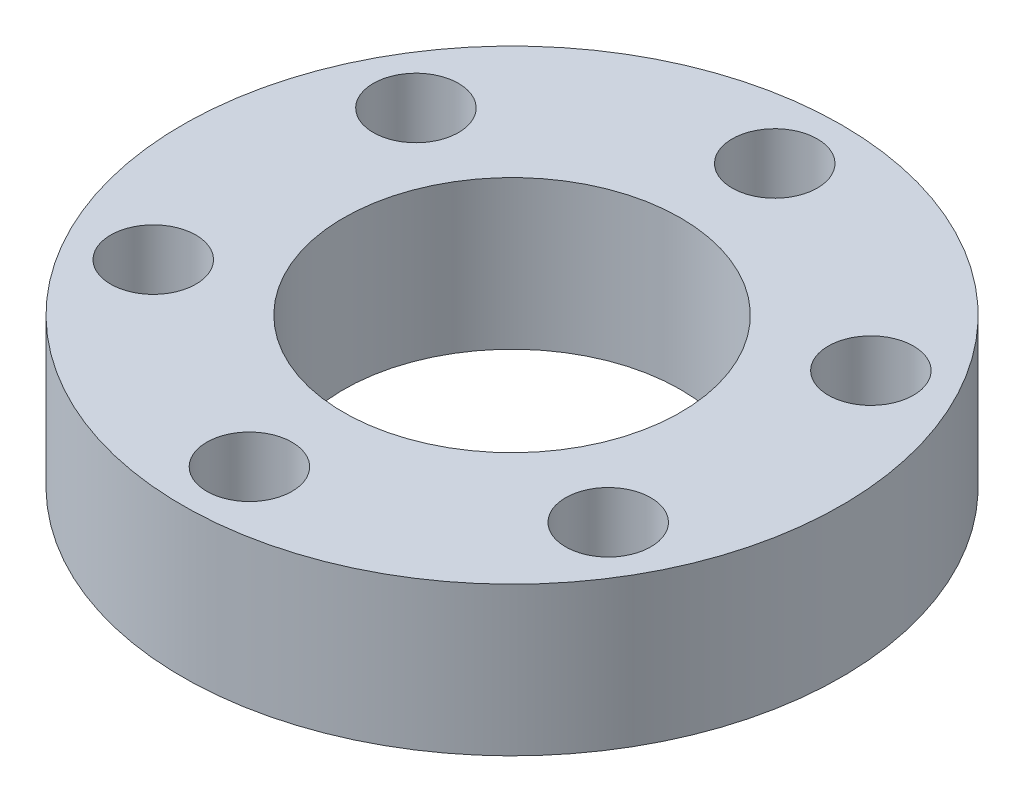
ISO-10303-21;
HEADER;
FILE_DESCRIPTION(('STEP AP214'),'2;1');
FILE_NAME('part.step','',(''),(''),'','','');
FILE_SCHEMA(('AUTOMOTIVE_DESIGN { 1 0 10303 214 1 1 1 1 }'));
ENDSEC;
DATA;
#1=APPLICATION_CONTEXT('core data for automotive mechanical design processes');
#2=APPLICATION_PROTOCOL_DEFINITION('international standard','automotive_design',2000,#1);
#3=PRODUCT_CONTEXT('',#1,'mechanical');
#4=PRODUCT('Part','Part','',(#3));
#5=PRODUCT_RELATED_PRODUCT_CATEGORY('part','',(#4));
#6=PRODUCT_DEFINITION_FORMATION('','',#4);
#7=PRODUCT_DEFINITION_CONTEXT('part definition',#1,'design');
#8=PRODUCT_DEFINITION('design','',#6,#7);
#9=PRODUCT_DEFINITION_SHAPE('','',#8);
#10=(LENGTH_UNIT() NAMED_UNIT(*) SI_UNIT(.MILLI.,.METRE.));
#11=(NAMED_UNIT(*) PLANE_ANGLE_UNIT() SI_UNIT($,.RADIAN.));
#12=(NAMED_UNIT(*) SI_UNIT($,.STERADIAN.) SOLID_ANGLE_UNIT());
#13=UNCERTAINTY_MEASURE_WITH_UNIT(LENGTH_MEASURE(1.E-05),#10,'distance_accuracy_value','');
#14=(GEOMETRIC_REPRESENTATION_CONTEXT(3) GLOBAL_UNCERTAINTY_ASSIGNED_CONTEXT((#13)) GLOBAL_UNIT_ASSIGNED_CONTEXT((#10,
#11,#12)) REPRESENTATION_CONTEXT('',''));
#15=CARTESIAN_POINT('',(0.,0.,0.));
#16=DIRECTION('',(0.,0.,1.));
#17=DIRECTION('',(1.,0.,0.));
#18=AXIS2_PLACEMENT_3D('',#15,#16,#17);
#19=CARTESIAN_POINT('',(0.,7.62,0.));
#20=DIRECTION('',(0.,1.,0.));
#21=DIRECTION('',(0.,0.,1.));
#22=AXIS2_PLACEMENT_3D('',#19,#20,#21);
#23=PLANE('',#22);
#24=CARTESIAN_POINT('',(11.6584339857462,7.62,6.73099999999989));
#25=DIRECTION('',(0.,1.,0.));
#26=DIRECTION('',(-0.866025403784443,0.,-0.499999999999992));
#27=AXIS2_PLACEMENT_3D('',#24,#25,#26);
#28=CIRCLE('',#27,2.1844);
#29=CARTESIAN_POINT('',(11.6584339857462,7.62,4.54659999999989));
#30=VERTEX_POINT('',#29);
#31=EDGE_CURVE('E68',#30,#30,#28,.T.);
#32=ORIENTED_EDGE('',*,*,#31,.F.);
#33=EDGE_LOOP('',(#32));
#34=FACE_BOUND('',#33,.T.);
#35=CARTESIAN_POINT('',(-11.6584339857461,7.62,6.73100000000006));
#36=DIRECTION('',(0.,1.,0.));
#37=DIRECTION('',(0.866025403784436,0.,-0.500000000000004));
#38=AXIS2_PLACEMENT_3D('',#35,#36,#37);
#39=CIRCLE('',#38,2.1844);
#40=CARTESIAN_POINT('',(-11.6584339857461,7.62,4.54660000000005));
#41=VERTEX_POINT('',#40);
#42=EDGE_CURVE('E56',#41,#41,#39,.T.);
#43=ORIENTED_EDGE('',*,*,#42,.F.);
#44=EDGE_LOOP('',(#43));
#45=FACE_BOUND('',#44,.T.);
#46=CARTESIAN_POINT('',(0.,7.62,-13.462));
#47=DIRECTION('',(0.,1.,0.));
#48=DIRECTION('',(0.,0.,1.));
#49=AXIS2_PLACEMENT_3D('',#46,#47,#48);
#50=CIRCLE('',#49,2.1844);
#51=CARTESIAN_POINT('',(0.,7.62,-15.6464));
#52=VERTEX_POINT('',#51);
#53=EDGE_CURVE('E44',#52,#52,#50,.T.);
#54=ORIENTED_EDGE('',*,*,#53,.F.);
#55=EDGE_LOOP('',(#54));
#56=FACE_BOUND('',#55,.T.);
#57=CARTESIAN_POINT('',(0.,7.62,0.));
#58=DIRECTION('',(0.,1.,0.));
#59=DIRECTION('',(0.,0.,1.));
#60=AXIS2_PLACEMENT_3D('',#57,#58,#59);
#61=CIRCLE('',#60,16.891);
#62=CARTESIAN_POINT('',(0.,7.62,-16.891));
#63=VERTEX_POINT('',#62);
#64=EDGE_CURVE('E10',#63,#63,#61,.T.);
#65=ORIENTED_EDGE('',*,*,#64,.T.);
#66=EDGE_LOOP('',(#65));
#67=FACE_BOUND('',#66,.T.);
#68=CARTESIAN_POINT('',(0.,7.62,0.));
#69=DIRECTION('',(0.,1.,0.));
#70=DIRECTION('',(0.,0.,1.));
#71=AXIS2_PLACEMENT_3D('',#68,#69,#70);
#72=CIRCLE('',#71,8.636);
#73=CARTESIAN_POINT('',(0.,7.62,-8.636));
#74=VERTEX_POINT('',#73);
#75=EDGE_CURVE('E39',#74,#74,#72,.T.);
#76=ORIENTED_EDGE('',*,*,#75,.F.);
#77=EDGE_LOOP('',(#76));
#78=FACE_BOUND('',#77,.T.);
#79=CARTESIAN_POINT('',(-11.6584339857461,7.62,-6.73099999999997));
#80=DIRECTION('',(0.,1.,0.));
#81=DIRECTION('',(0.86602540378444,0.,0.499999999999998));
#82=AXIS2_PLACEMENT_3D('',#79,#80,#81);
#83=CIRCLE('',#82,2.1844);
#84=CARTESIAN_POINT('',(-11.6584339857461,7.62,-8.91539999999997));
#85=VERTEX_POINT('',#84);
#86=EDGE_CURVE('E50',#85,#85,#83,.T.);
#87=ORIENTED_EDGE('',*,*,#86,.F.);
#88=EDGE_LOOP('',(#87));
#89=FACE_BOUND('',#88,.T.);
#90=CARTESIAN_POINT('',(0.,7.62,13.462));
#91=DIRECTION('',(0.,1.,0.));
#92=DIRECTION('',(0.,0.,-1.));
#93=AXIS2_PLACEMENT_3D('',#90,#91,#92);
#94=CIRCLE('',#93,2.1844);
#95=CARTESIAN_POINT('',(0.,7.62,11.2776));
#96=VERTEX_POINT('',#95);
#97=EDGE_CURVE('E62',#96,#96,#94,.T.);
#98=ORIENTED_EDGE('',*,*,#97,.F.);
#99=EDGE_LOOP('',(#98));
#100=FACE_BOUND('',#99,.T.);
#101=CARTESIAN_POINT('',(11.658433985746,7.62,-6.73100000000014));
#102=DIRECTION('',(0.,1.,0.));
#103=DIRECTION('',(-0.866025403784433,0.,0.50000000000001));
#104=AXIS2_PLACEMENT_3D('',#101,#102,#103);
#105=CIRCLE('',#104,2.1844);
#106=CARTESIAN_POINT('',(11.658433985746,7.62,-8.91540000000013));
#107=VERTEX_POINT('',#106);
#108=EDGE_CURVE('E74',#107,#107,#105,.T.);
#109=ORIENTED_EDGE('',*,*,#108,.F.);
#110=EDGE_LOOP('',(#109));
#111=FACE_BOUND('',#110,.T.);
#112=ADVANCED_FACE('F28',(#34,#45,#56,#67,#78,#89,#100,#111),#23,.T.);
#113=CARTESIAN_POINT('',(0.,0.,0.));
#114=DIRECTION('',(0.,1.,0.));
#115=DIRECTION('',(0.,0.,1.));
#116=AXIS2_PLACEMENT_3D('',#113,#114,#115);
#117=PLANE('',#116);
#118=CARTESIAN_POINT('',(11.6584339857462,0.,6.73099999999989));
#119=DIRECTION('',(0.,1.,0.));
#120=DIRECTION('',(-0.866025403784443,0.,-0.499999999999992));
#121=AXIS2_PLACEMENT_3D('',#118,#119,#120);
#122=CIRCLE('',#121,2.1844);
#123=CARTESIAN_POINT('',(11.6584339857462,0.,4.54659999999989));
#124=VERTEX_POINT('',#123);
#125=EDGE_CURVE('E71',#124,#124,#122,.T.);
#126=ORIENTED_EDGE('',*,*,#125,.T.);
#127=EDGE_LOOP('',(#126));
#128=FACE_BOUND('',#127,.T.);
#129=CARTESIAN_POINT('',(-11.6584339857461,0.,6.73100000000006));
#130=DIRECTION('',(0.,1.,0.));
#131=DIRECTION('',(0.866025403784436,0.,-0.500000000000004));
#132=AXIS2_PLACEMENT_3D('',#129,#130,#131);
#133=CIRCLE('',#132,2.1844);
#134=CARTESIAN_POINT('',(-11.6584339857461,0.,4.54660000000005));
#135=VERTEX_POINT('',#134);
#136=EDGE_CURVE('E59',#135,#135,#133,.T.);
#137=ORIENTED_EDGE('',*,*,#136,.T.);
#138=EDGE_LOOP('',(#137));
#139=FACE_BOUND('',#138,.T.);
#140=CARTESIAN_POINT('',(0.,0.,-13.462));
#141=DIRECTION('',(0.,1.,0.));
#142=DIRECTION('',(0.,0.,1.));
#143=AXIS2_PLACEMENT_3D('',#140,#141,#142);
#144=CIRCLE('',#143,2.1844);
#145=CARTESIAN_POINT('',(0.,0.,-15.6464));
#146=VERTEX_POINT('',#145);
#147=EDGE_CURVE('E47',#146,#146,#144,.T.);
#148=ORIENTED_EDGE('',*,*,#147,.T.);
#149=EDGE_LOOP('',(#148));
#150=FACE_BOUND('',#149,.T.);
#151=CARTESIAN_POINT('',(0.,0.,0.));
#152=DIRECTION('',(0.,1.,0.));
#153=DIRECTION('',(0.,0.,1.));
#154=AXIS2_PLACEMENT_3D('',#151,#152,#153);
#155=CIRCLE('',#154,16.891);
#156=CARTESIAN_POINT('',(0.,0.,-16.891));
#157=VERTEX_POINT('',#156);
#158=EDGE_CURVE('E32',#157,#157,#155,.T.);
#159=ORIENTED_EDGE('',*,*,#158,.F.);
#160=EDGE_LOOP('',(#159));
#161=FACE_BOUND('',#160,.T.);
#162=CARTESIAN_POINT('',(0.,0.,0.));
#163=DIRECTION('',(0.,1.,0.));
#164=DIRECTION('',(0.,0.,1.));
#165=AXIS2_PLACEMENT_3D('',#162,#163,#164);
#166=CIRCLE('',#165,8.636);
#167=CARTESIAN_POINT('',(0.,0.,-8.636));
#168=VERTEX_POINT('',#167);
#169=EDGE_CURVE('E41',#168,#168,#166,.T.);
#170=ORIENTED_EDGE('',*,*,#169,.T.);
#171=EDGE_LOOP('',(#170));
#172=FACE_BOUND('',#171,.T.);
#173=CARTESIAN_POINT('',(-11.6584339857461,0.,-6.73099999999997));
#174=DIRECTION('',(0.,1.,0.));
#175=DIRECTION('',(0.86602540378444,0.,0.499999999999998));
#176=AXIS2_PLACEMENT_3D('',#173,#174,#175);
#177=CIRCLE('',#176,2.1844);
#178=CARTESIAN_POINT('',(-11.6584339857461,0.,-8.91539999999997));
#179=VERTEX_POINT('',#178);
#180=EDGE_CURVE('E53',#179,#179,#177,.T.);
#181=ORIENTED_EDGE('',*,*,#180,.T.);
#182=EDGE_LOOP('',(#181));
#183=FACE_BOUND('',#182,.T.);
#184=CARTESIAN_POINT('',(0.,0.,13.462));
#185=DIRECTION('',(0.,1.,0.));
#186=DIRECTION('',(0.,0.,-1.));
#187=AXIS2_PLACEMENT_3D('',#184,#185,#186);
#188=CIRCLE('',#187,2.1844);
#189=CARTESIAN_POINT('',(0.,0.,11.2776));
#190=VERTEX_POINT('',#189);
#191=EDGE_CURVE('E65',#190,#190,#188,.T.);
#192=ORIENTED_EDGE('',*,*,#191,.T.);
#193=EDGE_LOOP('',(#192));
#194=FACE_BOUND('',#193,.T.);
#195=CARTESIAN_POINT('',(11.658433985746,0.,-6.73100000000014));
#196=DIRECTION('',(0.,1.,0.));
#197=DIRECTION('',(-0.866025403784433,0.,0.50000000000001));
#198=AXIS2_PLACEMENT_3D('',#195,#196,#197);
#199=CIRCLE('',#198,2.1844);
#200=CARTESIAN_POINT('',(11.658433985746,0.,-8.91540000000013));
#201=VERTEX_POINT('',#200);
#202=EDGE_CURVE('E77',#201,#201,#199,.T.);
#203=ORIENTED_EDGE('',*,*,#202,.T.);
#204=EDGE_LOOP('',(#203));
#205=FACE_BOUND('',#204,.T.);
#206=ADVANCED_FACE('F87',(#128,#139,#150,#161,#172,#183,#194,#205),#117,.F.);
#207=CARTESIAN_POINT('',(0.,7.62,0.));
#208=DIRECTION('',(0.,-1.,0.));
#209=DIRECTION('',(0.,0.,-1.));
#210=AXIS2_PLACEMENT_3D('',#207,#208,#209);
#211=CYLINDRICAL_SURFACE('',#210,16.891);
#212=CARTESIAN_POINT('',(0.,7.62,-16.891));
#213=CARTESIAN_POINT('',(0.,7.540625,-16.891));
#214=CARTESIAN_POINT('',(0.,7.46125,-16.891));
#215=CARTESIAN_POINT('',(0.,7.3025,-16.891));
#216=CARTESIAN_POINT('',(0.,7.223125,-16.891));
#217=CARTESIAN_POINT('',(0.,7.064375,-16.891));
#218=CARTESIAN_POINT('',(0.,6.985,-16.891));
#219=CARTESIAN_POINT('',(0.,6.82625,-16.891));
#220=CARTESIAN_POINT('',(0.,6.746875,-16.891));
#221=CARTESIAN_POINT('',(0.,6.588125,-16.891));
#222=CARTESIAN_POINT('',(0.,6.50875,-16.891));
#223=CARTESIAN_POINT('',(0.,6.35,-16.891));
#224=CARTESIAN_POINT('',(0.,6.270625,-16.891));
#225=CARTESIAN_POINT('',(0.,6.111875,-16.891));
#226=CARTESIAN_POINT('',(0.,6.0325,-16.891));
#227=CARTESIAN_POINT('',(0.,5.87375,-16.891));
#228=CARTESIAN_POINT('',(0.,5.794375,-16.891));
#229=CARTESIAN_POINT('',(0.,5.635625,-16.891));
#230=CARTESIAN_POINT('',(0.,5.55625,-16.891));
#231=CARTESIAN_POINT('',(0.,5.3975,-16.891));
#232=CARTESIAN_POINT('',(0.,5.318125,-16.891));
#233=CARTESIAN_POINT('',(0.,5.159375,-16.891));
#234=CARTESIAN_POINT('',(0.,5.08,-16.891));
#235=CARTESIAN_POINT('',(0.,4.92125,-16.891));
#236=CARTESIAN_POINT('',(0.,4.841875,-16.891));
#237=CARTESIAN_POINT('',(0.,4.683125,-16.891));
#238=CARTESIAN_POINT('',(0.,4.60375,-16.891));
#239=CARTESIAN_POINT('',(0.,4.445,-16.891));
#240=CARTESIAN_POINT('',(0.,4.365625,-16.891));
#241=CARTESIAN_POINT('',(0.,4.206875,-16.891));
#242=CARTESIAN_POINT('',(0.,4.1275,-16.891));
#243=CARTESIAN_POINT('',(0.,3.96875,-16.891));
#244=CARTESIAN_POINT('',(0.,3.889375,-16.891));
#245=CARTESIAN_POINT('',(0.,3.730625,-16.891));
#246=CARTESIAN_POINT('',(0.,3.65125,-16.891));
#247=CARTESIAN_POINT('',(0.,3.4925,-16.891));
#248=CARTESIAN_POINT('',(0.,3.413125,-16.891));
#249=CARTESIAN_POINT('',(0.,3.254375,-16.891));
#250=CARTESIAN_POINT('',(0.,3.175,-16.891));
#251=CARTESIAN_POINT('',(0.,3.01625,-16.891));
#252=CARTESIAN_POINT('',(0.,2.936875,-16.891));
#253=CARTESIAN_POINT('',(0.,2.778125,-16.891));
#254=CARTESIAN_POINT('',(0.,2.69875,-16.891));
#255=CARTESIAN_POINT('',(0.,2.54,-16.891));
#256=CARTESIAN_POINT('',(0.,2.460625,-16.891));
#257=CARTESIAN_POINT('',(0.,2.301875,-16.891));
#258=CARTESIAN_POINT('',(0.,2.2225,-16.891));
#259=CARTESIAN_POINT('',(0.,2.06375,-16.891));
#260=CARTESIAN_POINT('',(0.,1.984375,-16.891));
#261=CARTESIAN_POINT('',(0.,1.825625,-16.891));
#262=CARTESIAN_POINT('',(0.,1.74625,-16.891));
#263=CARTESIAN_POINT('',(0.,1.5875,-16.891));
#264=CARTESIAN_POINT('',(0.,1.508125,-16.891));
#265=CARTESIAN_POINT('',(0.,1.349375,-16.891));
#266=CARTESIAN_POINT('',(0.,1.27,-16.891));
#267=CARTESIAN_POINT('',(0.,1.11125,-16.891));
#268=CARTESIAN_POINT('',(0.,1.031875,-16.891));
#269=CARTESIAN_POINT('',(0.,0.873125,-16.891));
#270=CARTESIAN_POINT('',(0.,0.79375,-16.891));
#271=CARTESIAN_POINT('',(0.,0.635,-16.891));
#272=CARTESIAN_POINT('',(0.,0.555625,-16.891));
#273=CARTESIAN_POINT('',(0.,0.396875,-16.891));
#274=CARTESIAN_POINT('',(0.,0.3175,-16.891));
#275=CARTESIAN_POINT('',(0.,0.15875,-16.891));
#276=CARTESIAN_POINT('',(0.,0.0793749999999999,-16.891));
#277=CARTESIAN_POINT('',(0.,0.,-16.891));
#278=B_SPLINE_CURVE_WITH_KNOTS('',3,(#212,#213,#214,#215,#216,#217,#218,#219,#220,#221,#222,
#223,#224,#225,#226,#227,#228,#229,#230,#231,#232,#233,#234,#235,#236,#237,#238,#239,#240,#241,
#242,#243,#244,#245,#246,#247,#248,#249,#250,#251,#252,#253,#254,#255,#256,#257,#258,#259,#260,
#261,#262,#263,#264,#265,#266,#267,#268,#269,#270,#271,#272,#273,#274,#275,#276,#277),
.UNSPECIFIED.,.F.,.F.,(4,2,2,2,2,2,2,2,2,2,2,2,2,2,2,2,2,2,2,2,2,2,2,2,2,2,2,2,2,2,2,2,4),(0.,
0.238125,0.476249999999999,0.714375,0.952499999999999,1.190625,1.42875,1.666875,1.905,2.143125,
2.38125,2.619375,2.8575,3.095625,3.33375,3.571875,3.81,4.048125,4.28625,4.524375,4.7625,
5.000625,5.23875,5.476875,5.715,5.953125,6.19125,6.429375,6.6675,6.905625,7.14375,7.381875,
7.62),.UNSPECIFIED.);
#279=EDGE_CURVE('BSEAM30',#63,#157,#278,.T.);
#280=ORIENTED_EDGE('',*,*,#64,.F.);
#281=ORIENTED_EDGE('',*,*,#158,.T.);
#282=ORIENTED_EDGE('',*,*,#279,.T.);
#283=ORIENTED_EDGE('',*,*,#279,.F.);
#284=EDGE_LOOP('',(#280,#282,#281,#283));
#285=FACE_BOUND('',#284,.T.);
#286=ADVANCED_FACE('F30',(#285),#211,.T.);
#287=CARTESIAN_POINT('',(0.,7.62,0.));
#288=DIRECTION('',(0.,-1.,0.));
#289=DIRECTION('',(0.,0.,-1.));
#290=AXIS2_PLACEMENT_3D('',#287,#288,#289);
#291=CYLINDRICAL_SURFACE('',#290,8.636);
#292=CARTESIAN_POINT('',(0.,7.62,-8.636));
#293=CARTESIAN_POINT('',(0.,7.540625,-8.636));
#294=CARTESIAN_POINT('',(0.,7.46125,-8.636));
#295=CARTESIAN_POINT('',(0.,7.3025,-8.636));
#296=CARTESIAN_POINT('',(0.,7.223125,-8.636));
#297=CARTESIAN_POINT('',(0.,7.064375,-8.636));
#298=CARTESIAN_POINT('',(0.,6.985,-8.636));
#299=CARTESIAN_POINT('',(0.,6.82625,-8.636));
#300=CARTESIAN_POINT('',(0.,6.746875,-8.636));
#301=CARTESIAN_POINT('',(0.,6.588125,-8.636));
#302=CARTESIAN_POINT('',(0.,6.50875,-8.636));
#303=CARTESIAN_POINT('',(0.,6.35,-8.636));
#304=CARTESIAN_POINT('',(0.,6.270625,-8.636));
#305=CARTESIAN_POINT('',(0.,6.111875,-8.636));
#306=CARTESIAN_POINT('',(0.,6.0325,-8.636));
#307=CARTESIAN_POINT('',(0.,5.87375,-8.636));
#308=CARTESIAN_POINT('',(0.,5.794375,-8.636));
#309=CARTESIAN_POINT('',(0.,5.635625,-8.636));
#310=CARTESIAN_POINT('',(0.,5.55625,-8.636));
#311=CARTESIAN_POINT('',(0.,5.3975,-8.636));
#312=CARTESIAN_POINT('',(0.,5.318125,-8.636));
#313=CARTESIAN_POINT('',(0.,5.159375,-8.636));
#314=CARTESIAN_POINT('',(0.,5.08,-8.636));
#315=CARTESIAN_POINT('',(0.,4.92125,-8.636));
#316=CARTESIAN_POINT('',(0.,4.841875,-8.636));
#317=CARTESIAN_POINT('',(0.,4.683125,-8.636));
#318=CARTESIAN_POINT('',(0.,4.60375,-8.636));
#319=CARTESIAN_POINT('',(0.,4.445,-8.636));
#320=CARTESIAN_POINT('',(0.,4.365625,-8.636));
#321=CARTESIAN_POINT('',(0.,4.206875,-8.636));
#322=CARTESIAN_POINT('',(0.,4.1275,-8.636));
#323=CARTESIAN_POINT('',(0.,3.96875,-8.636));
#324=CARTESIAN_POINT('',(0.,3.889375,-8.636));
#325=CARTESIAN_POINT('',(0.,3.730625,-8.636));
#326=CARTESIAN_POINT('',(0.,3.65125,-8.636));
#327=CARTESIAN_POINT('',(0.,3.4925,-8.636));
#328=CARTESIAN_POINT('',(0.,3.413125,-8.636));
#329=CARTESIAN_POINT('',(0.,3.254375,-8.636));
#330=CARTESIAN_POINT('',(0.,3.175,-8.636));
#331=CARTESIAN_POINT('',(0.,3.01625,-8.636));
#332=CARTESIAN_POINT('',(0.,2.936875,-8.636));
#333=CARTESIAN_POINT('',(0.,2.778125,-8.636));
#334=CARTESIAN_POINT('',(0.,2.69875,-8.636));
#335=CARTESIAN_POINT('',(0.,2.54,-8.636));
#336=CARTESIAN_POINT('',(0.,2.460625,-8.636));
#337=CARTESIAN_POINT('',(0.,2.301875,-8.636));
#338=CARTESIAN_POINT('',(0.,2.2225,-8.636));
#339=CARTESIAN_POINT('',(0.,2.06375,-8.636));
#340=CARTESIAN_POINT('',(0.,1.984375,-8.636));
#341=CARTESIAN_POINT('',(0.,1.825625,-8.636));
#342=CARTESIAN_POINT('',(0.,1.74625,-8.636));
#343=CARTESIAN_POINT('',(0.,1.5875,-8.636));
#344=CARTESIAN_POINT('',(0.,1.508125,-8.636));
#345=CARTESIAN_POINT('',(0.,1.349375,-8.636));
#346=CARTESIAN_POINT('',(0.,1.27,-8.636));
#347=CARTESIAN_POINT('',(0.,1.11125,-8.636));
#348=CARTESIAN_POINT('',(0.,1.031875,-8.636));
#349=CARTESIAN_POINT('',(0.,0.873125,-8.636));
#350=CARTESIAN_POINT('',(0.,0.79375,-8.636));
#351=CARTESIAN_POINT('',(0.,0.635,-8.636));
#352=CARTESIAN_POINT('',(0.,0.555625,-8.636));
#353=CARTESIAN_POINT('',(0.,0.396875,-8.636));
#354=CARTESIAN_POINT('',(0.,0.3175,-8.636));
#355=CARTESIAN_POINT('',(0.,0.15875,-8.636));
#356=CARTESIAN_POINT('',(0.,0.0793749999999999,-8.636));
#357=CARTESIAN_POINT('',(0.,0.,-8.636));
#358=B_SPLINE_CURVE_WITH_KNOTS('',3,(#292,#293,#294,#295,#296,#297,#298,#299,#300,#301,#302,
#303,#304,#305,#306,#307,#308,#309,#310,#311,#312,#313,#314,#315,#316,#317,#318,#319,#320,#321,
#322,#323,#324,#325,#326,#327,#328,#329,#330,#331,#332,#333,#334,#335,#336,#337,#338,#339,#340,
#341,#342,#343,#344,#345,#346,#347,#348,#349,#350,#351,#352,#353,#354,#355,#356,#357),
.UNSPECIFIED.,.F.,.F.,(4,2,2,2,2,2,2,2,2,2,2,2,2,2,2,2,2,2,2,2,2,2,2,2,2,2,2,2,2,2,2,2,4),(0.,
0.238125,0.47625,0.714375000000001,0.9525,1.190625,1.42875,1.666875,1.905,2.143125,2.38125,
2.619375,2.8575,3.095625,3.33375,3.571875,3.81,4.048125,4.28625,4.524375,4.7625,5.000625,
5.23875,5.476875,5.715,5.953125,6.19125,6.429375,6.6675,6.905625,7.14375,7.381875,7.62),.UNSPECIFIED.);
#359=EDGE_CURVE('BSEAM97',#74,#168,#358,.T.);
#360=ORIENTED_EDGE('',*,*,#75,.T.);
#361=ORIENTED_EDGE('',*,*,#169,.F.);
#362=ORIENTED_EDGE('',*,*,#359,.T.);
#363=ORIENTED_EDGE('',*,*,#359,.F.);
#364=EDGE_LOOP('',(#360,#362,#361,#363));
#365=FACE_BOUND('',#364,.T.);
#366=ADVANCED_FACE('F97',(#365),#291,.F.);
#367=CARTESIAN_POINT('',(0.,7.62,-13.462));
#368=DIRECTION('',(0.,-1.,0.));
#369=DIRECTION('',(0.,0.,-1.));
#370=AXIS2_PLACEMENT_3D('',#367,#368,#369);
#371=CYLINDRICAL_SURFACE('',#370,2.1844);
#372=CARTESIAN_POINT('',(0.,7.62,-15.6464));
#373=CARTESIAN_POINT('',(0.,7.540625,-15.6464));
#374=CARTESIAN_POINT('',(0.,7.46125,-15.6464));
#375=CARTESIAN_POINT('',(0.,7.3025,-15.6464));
#376=CARTESIAN_POINT('',(0.,7.223125,-15.6464));
#377=CARTESIAN_POINT('',(0.,7.064375,-15.6464));
#378=CARTESIAN_POINT('',(0.,6.985,-15.6464));
#379=CARTESIAN_POINT('',(0.,6.82625,-15.6464));
#380=CARTESIAN_POINT('',(0.,6.746875,-15.6464));
#381=CARTESIAN_POINT('',(0.,6.588125,-15.6464));
#382=CARTESIAN_POINT('',(0.,6.50875,-15.6464));
#383=CARTESIAN_POINT('',(0.,6.35,-15.6464));
#384=CARTESIAN_POINT('',(0.,6.270625,-15.6464));
#385=CARTESIAN_POINT('',(0.,6.111875,-15.6464));
#386=CARTESIAN_POINT('',(0.,6.0325,-15.6464));
#387=CARTESIAN_POINT('',(0.,5.87375,-15.6464));
#388=CARTESIAN_POINT('',(0.,5.794375,-15.6464));
#389=CARTESIAN_POINT('',(0.,5.635625,-15.6464));
#390=CARTESIAN_POINT('',(0.,5.55625,-15.6464));
#391=CARTESIAN_POINT('',(0.,5.3975,-15.6464));
#392=CARTESIAN_POINT('',(0.,5.318125,-15.6464));
#393=CARTESIAN_POINT('',(0.,5.159375,-15.6464));
#394=CARTESIAN_POINT('',(0.,5.08,-15.6464));
#395=CARTESIAN_POINT('',(0.,4.92125,-15.6464));
#396=CARTESIAN_POINT('',(0.,4.841875,-15.6464));
#397=CARTESIAN_POINT('',(0.,4.683125,-15.6464));
#398=CARTESIAN_POINT('',(0.,4.60375,-15.6464));
#399=CARTESIAN_POINT('',(0.,4.445,-15.6464));
#400=CARTESIAN_POINT('',(0.,4.365625,-15.6464));
#401=CARTESIAN_POINT('',(0.,4.206875,-15.6464));
#402=CARTESIAN_POINT('',(0.,4.1275,-15.6464));
#403=CARTESIAN_POINT('',(0.,3.96875,-15.6464));
#404=CARTESIAN_POINT('',(0.,3.889375,-15.6464));
#405=CARTESIAN_POINT('',(0.,3.730625,-15.6464));
#406=CARTESIAN_POINT('',(0.,3.65125,-15.6464));
#407=CARTESIAN_POINT('',(0.,3.4925,-15.6464));
#408=CARTESIAN_POINT('',(0.,3.413125,-15.6464));
#409=CARTESIAN_POINT('',(0.,3.254375,-15.6464));
#410=CARTESIAN_POINT('',(0.,3.175,-15.6464));
#411=CARTESIAN_POINT('',(0.,3.01625,-15.6464));
#412=CARTESIAN_POINT('',(0.,2.936875,-15.6464));
#413=CARTESIAN_POINT('',(0.,2.778125,-15.6464));
#414=CARTESIAN_POINT('',(0.,2.69875,-15.6464));
#415=CARTESIAN_POINT('',(0.,2.54,-15.6464));
#416=CARTESIAN_POINT('',(0.,2.460625,-15.6464));
#417=CARTESIAN_POINT('',(0.,2.301875,-15.6464));
#418=CARTESIAN_POINT('',(0.,2.2225,-15.6464));
#419=CARTESIAN_POINT('',(0.,2.06375,-15.6464));
#420=CARTESIAN_POINT('',(0.,1.984375,-15.6464));
#421=CARTESIAN_POINT('',(0.,1.825625,-15.6464));
#422=CARTESIAN_POINT('',(0.,1.74625,-15.6464));
#423=CARTESIAN_POINT('',(0.,1.5875,-15.6464));
#424=CARTESIAN_POINT('',(0.,1.508125,-15.6464));
#425=CARTESIAN_POINT('',(0.,1.349375,-15.6464));
#426=CARTESIAN_POINT('',(0.,1.27,-15.6464));
#427=CARTESIAN_POINT('',(0.,1.11125,-15.6464));
#428=CARTESIAN_POINT('',(0.,1.031875,-15.6464));
#429=CARTESIAN_POINT('',(0.,0.873125,-15.6464));
#430=CARTESIAN_POINT('',(0.,0.79375,-15.6464));
#431=CARTESIAN_POINT('',(0.,0.635,-15.6464));
#432=CARTESIAN_POINT('',(0.,0.555625,-15.6464));
#433=CARTESIAN_POINT('',(0.,0.396875,-15.6464));
#434=CARTESIAN_POINT('',(0.,0.3175,-15.6464));
#435=CARTESIAN_POINT('',(0.,0.15875,-15.6464));
#436=CARTESIAN_POINT('',(0.,0.0793749999999999,-15.6464));
#437=CARTESIAN_POINT('',(0.,0.,-15.6464));
#438=B_SPLINE_CURVE_WITH_KNOTS('',3,(#372,#373,#374,#375,#376,#377,#378,#379,#380,#381,#382,
#383,#384,#385,#386,#387,#388,#389,#390,#391,#392,#393,#394,#395,#396,#397,#398,#399,#400,#401,
#402,#403,#404,#405,#406,#407,#408,#409,#410,#411,#412,#413,#414,#415,#416,#417,#418,#419,#420,
#421,#422,#423,#424,#425,#426,#427,#428,#429,#430,#431,#432,#433,#434,#435,#436,#437),
.UNSPECIFIED.,.F.,.F.,(4,2,2,2,2,2,2,2,2,2,2,2,2,2,2,2,2,2,2,2,2,2,2,2,2,2,2,2,2,2,2,2,4),(0.,
0.238125,0.47625,0.714375000000001,0.9525,1.190625,1.42875,1.666875,1.905,2.143125,2.38125,
2.619375,2.8575,3.095625,3.33375,3.571875,3.81,4.048125,4.28625,4.524375,4.7625,5.000625,
5.23875,5.476875,5.715,5.953125,6.19125,6.429375,6.6675,6.905625,7.14375,7.381875,7.62),.UNSPECIFIED.);
#439=EDGE_CURVE('BSEAM100',#52,#146,#438,.T.);
#440=ORIENTED_EDGE('',*,*,#53,.T.);
#441=ORIENTED_EDGE('',*,*,#147,.F.);
#442=ORIENTED_EDGE('',*,*,#439,.T.);
#443=ORIENTED_EDGE('',*,*,#439,.F.);
#444=EDGE_LOOP('',(#440,#442,#441,#443));
#445=FACE_BOUND('',#444,.T.);
#446=ADVANCED_FACE('F100',(#445),#371,.F.);
#447=CARTESIAN_POINT('',(-11.6584339857461,7.62,-6.73099999999997));
#448=DIRECTION('',(0.,-1.,0.));
#449=DIRECTION('',(0.,0.,-1.));
#450=AXIS2_PLACEMENT_3D('',#447,#448,#449);
#451=CYLINDRICAL_SURFACE('',#450,2.1844);
#452=CARTESIAN_POINT('',(-11.6584339857461,7.62,-8.91539999999997));
#453=CARTESIAN_POINT('',(-11.6584339857461,7.540625,-8.91539999999997));
#454=CARTESIAN_POINT('',(-11.6584339857461,7.46125,-8.91539999999997));
#455=CARTESIAN_POINT('',(-11.6584339857461,7.3025,-8.91539999999997));
#456=CARTESIAN_POINT('',(-11.6584339857461,7.223125,-8.91539999999997));
#457=CARTESIAN_POINT('',(-11.6584339857461,7.064375,-8.91539999999997));
#458=CARTESIAN_POINT('',(-11.6584339857461,6.985,-8.91539999999997));
#459=CARTESIAN_POINT('',(-11.6584339857461,6.82625,-8.91539999999997));
#460=CARTESIAN_POINT('',(-11.6584339857461,6.746875,-8.91539999999997));
#461=CARTESIAN_POINT('',(-11.6584339857461,6.588125,-8.91539999999997));
#462=CARTESIAN_POINT('',(-11.6584339857461,6.50875,-8.91539999999997));
#463=CARTESIAN_POINT('',(-11.6584339857461,6.35,-8.91539999999997));
#464=CARTESIAN_POINT('',(-11.6584339857461,6.270625,-8.91539999999997));
#465=CARTESIAN_POINT('',(-11.6584339857461,6.111875,-8.91539999999997));
#466=CARTESIAN_POINT('',(-11.6584339857461,6.0325,-8.91539999999997));
#467=CARTESIAN_POINT('',(-11.6584339857461,5.87375,-8.91539999999997));
#468=CARTESIAN_POINT('',(-11.6584339857461,5.794375,-8.91539999999997));
#469=CARTESIAN_POINT('',(-11.6584339857461,5.635625,-8.91539999999997));
#470=CARTESIAN_POINT('',(-11.6584339857461,5.55625,-8.91539999999997));
#471=CARTESIAN_POINT('',(-11.6584339857461,5.3975,-8.91539999999997));
#472=CARTESIAN_POINT('',(-11.6584339857461,5.318125,-8.91539999999997));
#473=CARTESIAN_POINT('',(-11.6584339857461,5.159375,-8.91539999999997));
#474=CARTESIAN_POINT('',(-11.6584339857461,5.08,-8.91539999999997));
#475=CARTESIAN_POINT('',(-11.6584339857461,4.92125,-8.91539999999997));
#476=CARTESIAN_POINT('',(-11.6584339857461,4.841875,-8.91539999999997));
#477=CARTESIAN_POINT('',(-11.6584339857461,4.683125,-8.91539999999997));
#478=CARTESIAN_POINT('',(-11.6584339857461,4.60375,-8.91539999999997));
#479=CARTESIAN_POINT('',(-11.6584339857461,4.445,-8.91539999999997));
#480=CARTESIAN_POINT('',(-11.6584339857461,4.365625,-8.91539999999997));
#481=CARTESIAN_POINT('',(-11.6584339857461,4.206875,-8.91539999999997));
#482=CARTESIAN_POINT('',(-11.6584339857461,4.1275,-8.91539999999997));
#483=CARTESIAN_POINT('',(-11.6584339857461,3.96875,-8.91539999999997));
#484=CARTESIAN_POINT('',(-11.6584339857461,3.889375,-8.91539999999997));
#485=CARTESIAN_POINT('',(-11.6584339857461,3.730625,-8.91539999999997));
#486=CARTESIAN_POINT('',(-11.6584339857461,3.65125,-8.91539999999997));
#487=CARTESIAN_POINT('',(-11.6584339857461,3.4925,-8.91539999999997));
#488=CARTESIAN_POINT('',(-11.6584339857461,3.413125,-8.91539999999997));
#489=CARTESIAN_POINT('',(-11.6584339857461,3.254375,-8.91539999999997));
#490=CARTESIAN_POINT('',(-11.6584339857461,3.175,-8.91539999999997));
#491=CARTESIAN_POINT('',(-11.6584339857461,3.01625,-8.91539999999997));
#492=CARTESIAN_POINT('',(-11.6584339857461,2.936875,-8.91539999999997));
#493=CARTESIAN_POINT('',(-11.6584339857461,2.778125,-8.91539999999997));
#494=CARTESIAN_POINT('',(-11.6584339857461,2.69875,-8.91539999999997));
#495=CARTESIAN_POINT('',(-11.6584339857461,2.54,-8.91539999999997));
#496=CARTESIAN_POINT('',(-11.6584339857461,2.460625,-8.91539999999997));
#497=CARTESIAN_POINT('',(-11.6584339857461,2.301875,-8.91539999999997));
#498=CARTESIAN_POINT('',(-11.6584339857461,2.2225,-8.91539999999997));
#499=CARTESIAN_POINT('',(-11.6584339857461,2.06375,-8.91539999999997));
#500=CARTESIAN_POINT('',(-11.6584339857461,1.984375,-8.91539999999997));
#501=CARTESIAN_POINT('',(-11.6584339857461,1.825625,-8.91539999999997));
#502=CARTESIAN_POINT('',(-11.6584339857461,1.74625,-8.91539999999997));
#503=CARTESIAN_POINT('',(-11.6584339857461,1.5875,-8.91539999999997));
#504=CARTESIAN_POINT('',(-11.6584339857461,1.508125,-8.91539999999997));
#505=CARTESIAN_POINT('',(-11.6584339857461,1.349375,-8.91539999999997));
#506=CARTESIAN_POINT('',(-11.6584339857461,1.27,-8.91539999999997));
#507=CARTESIAN_POINT('',(-11.6584339857461,1.11125,-8.91539999999997));
#508=CARTESIAN_POINT('',(-11.6584339857461,1.031875,-8.91539999999997));
#509=CARTESIAN_POINT('',(-11.6584339857461,0.873125,-8.91539999999997));
#510=CARTESIAN_POINT('',(-11.6584339857461,0.79375,-8.91539999999997));
#511=CARTESIAN_POINT('',(-11.6584339857461,0.635,-8.91539999999997));
#512=CARTESIAN_POINT('',(-11.6584339857461,0.555625,-8.91539999999997));
#513=CARTESIAN_POINT('',(-11.6584339857461,0.396875,-8.91539999999997));
#514=CARTESIAN_POINT('',(-11.6584339857461,0.3175,-8.91539999999997));
#515=CARTESIAN_POINT('',(-11.6584339857461,0.15875,-8.91539999999997));
#516=CARTESIAN_POINT('',(-11.6584339857461,0.0793749999999999,-8.91539999999997));
#517=CARTESIAN_POINT('',(-11.6584339857461,0.,-8.91539999999997));
#518=B_SPLINE_CURVE_WITH_KNOTS('',3,(#452,#453,#454,#455,#456,#457,#458,#459,#460,#461,#462,
#463,#464,#465,#466,#467,#468,#469,#470,#471,#472,#473,#474,#475,#476,#477,#478,#479,#480,#481,
#482,#483,#484,#485,#486,#487,#488,#489,#490,#491,#492,#493,#494,#495,#496,#497,#498,#499,#500,
#501,#502,#503,#504,#505,#506,#507,#508,#509,#510,#511,#512,#513,#514,#515,#516,#517),
.UNSPECIFIED.,.F.,.F.,(4,2,2,2,2,2,2,2,2,2,2,2,2,2,2,2,2,2,2,2,2,2,2,2,2,2,2,2,2,2,2,2,4),(0.,
0.238125,0.47625,0.714375000000001,0.9525,1.190625,1.42875,1.666875,1.905,2.143125,2.38125,
2.619375,2.8575,3.095625,3.33375,3.571875,3.81,4.048125,4.28625,4.524375,4.7625,5.000625,
5.23875,5.476875,5.715,5.953125,6.19125,6.429375,6.6675,6.905625,7.14375,7.381875,7.62),.UNSPECIFIED.);
#519=EDGE_CURVE('BSEAM104',#85,#179,#518,.T.);
#520=ORIENTED_EDGE('',*,*,#86,.T.);
#521=ORIENTED_EDGE('',*,*,#180,.F.);
#522=ORIENTED_EDGE('',*,*,#519,.T.);
#523=ORIENTED_EDGE('',*,*,#519,.F.);
#524=EDGE_LOOP('',(#520,#522,#521,#523));
#525=FACE_BOUND('',#524,.T.);
#526=ADVANCED_FACE('F104',(#525),#451,.F.);
#527=CARTESIAN_POINT('',(-11.6584339857461,7.62,6.73100000000006));
#528=DIRECTION('',(0.,-1.,0.));
#529=DIRECTION('',(0.,0.,-1.));
#530=AXIS2_PLACEMENT_3D('',#527,#528,#529);
#531=CYLINDRICAL_SURFACE('',#530,2.1844);
#532=CARTESIAN_POINT('',(-11.6584339857461,7.62,4.54660000000005));
#533=CARTESIAN_POINT('',(-11.6584339857461,7.540625,4.54660000000005));
#534=CARTESIAN_POINT('',(-11.6584339857461,7.46125,4.54660000000005));
#535=CARTESIAN_POINT('',(-11.6584339857461,7.3025,4.54660000000005));
#536=CARTESIAN_POINT('',(-11.6584339857461,7.223125,4.54660000000005));
#537=CARTESIAN_POINT('',(-11.6584339857461,7.064375,4.54660000000005));
#538=CARTESIAN_POINT('',(-11.6584339857461,6.985,4.54660000000005));
#539=CARTESIAN_POINT('',(-11.6584339857461,6.82625,4.54660000000005));
#540=CARTESIAN_POINT('',(-11.6584339857461,6.746875,4.54660000000005));
#541=CARTESIAN_POINT('',(-11.6584339857461,6.588125,4.54660000000005));
#542=CARTESIAN_POINT('',(-11.6584339857461,6.50875,4.54660000000005));
#543=CARTESIAN_POINT('',(-11.6584339857461,6.35,4.54660000000005));
#544=CARTESIAN_POINT('',(-11.6584339857461,6.270625,4.54660000000005));
#545=CARTESIAN_POINT('',(-11.6584339857461,6.111875,4.54660000000005));
#546=CARTESIAN_POINT('',(-11.6584339857461,6.0325,4.54660000000005));
#547=CARTESIAN_POINT('',(-11.6584339857461,5.87375,4.54660000000005));
#548=CARTESIAN_POINT('',(-11.6584339857461,5.794375,4.54660000000005));
#549=CARTESIAN_POINT('',(-11.6584339857461,5.635625,4.54660000000005));
#550=CARTESIAN_POINT('',(-11.6584339857461,5.55625,4.54660000000005));
#551=CARTESIAN_POINT('',(-11.6584339857461,5.3975,4.54660000000005));
#552=CARTESIAN_POINT('',(-11.6584339857461,5.318125,4.54660000000005));
#553=CARTESIAN_POINT('',(-11.6584339857461,5.159375,4.54660000000005));
#554=CARTESIAN_POINT('',(-11.6584339857461,5.08,4.54660000000005));
#555=CARTESIAN_POINT('',(-11.6584339857461,4.92125,4.54660000000005));
#556=CARTESIAN_POINT('',(-11.6584339857461,4.841875,4.54660000000005));
#557=CARTESIAN_POINT('',(-11.6584339857461,4.683125,4.54660000000005));
#558=CARTESIAN_POINT('',(-11.6584339857461,4.60375,4.54660000000005));
#559=CARTESIAN_POINT('',(-11.6584339857461,4.445,4.54660000000005));
#560=CARTESIAN_POINT('',(-11.6584339857461,4.365625,4.54660000000005));
#561=CARTESIAN_POINT('',(-11.6584339857461,4.206875,4.54660000000005));
#562=CARTESIAN_POINT('',(-11.6584339857461,4.1275,4.54660000000005));
#563=CARTESIAN_POINT('',(-11.6584339857461,3.96875,4.54660000000005));
#564=CARTESIAN_POINT('',(-11.6584339857461,3.889375,4.54660000000005));
#565=CARTESIAN_POINT('',(-11.6584339857461,3.730625,4.54660000000005));
#566=CARTESIAN_POINT('',(-11.6584339857461,3.65125,4.54660000000005));
#567=CARTESIAN_POINT('',(-11.6584339857461,3.4925,4.54660000000005));
#568=CARTESIAN_POINT('',(-11.6584339857461,3.413125,4.54660000000005));
#569=CARTESIAN_POINT('',(-11.6584339857461,3.254375,4.54660000000005));
#570=CARTESIAN_POINT('',(-11.6584339857461,3.175,4.54660000000005));
#571=CARTESIAN_POINT('',(-11.6584339857461,3.01625,4.54660000000005));
#572=CARTESIAN_POINT('',(-11.6584339857461,2.936875,4.54660000000005));
#573=CARTESIAN_POINT('',(-11.6584339857461,2.778125,4.54660000000005));
#574=CARTESIAN_POINT('',(-11.6584339857461,2.69875,4.54660000000005));
#575=CARTESIAN_POINT('',(-11.6584339857461,2.54,4.54660000000005));
#576=CARTESIAN_POINT('',(-11.6584339857461,2.460625,4.54660000000005));
#577=CARTESIAN_POINT('',(-11.6584339857461,2.301875,4.54660000000005));
#578=CARTESIAN_POINT('',(-11.6584339857461,2.2225,4.54660000000005));
#579=CARTESIAN_POINT('',(-11.6584339857461,2.06375,4.54660000000005));
#580=CARTESIAN_POINT('',(-11.6584339857461,1.984375,4.54660000000005));
#581=CARTESIAN_POINT('',(-11.6584339857461,1.825625,4.54660000000005));
#582=CARTESIAN_POINT('',(-11.6584339857461,1.74625,4.54660000000005));
#583=CARTESIAN_POINT('',(-11.6584339857461,1.5875,4.54660000000005));
#584=CARTESIAN_POINT('',(-11.6584339857461,1.508125,4.54660000000005));
#585=CARTESIAN_POINT('',(-11.6584339857461,1.349375,4.54660000000005));
#586=CARTESIAN_POINT('',(-11.6584339857461,1.27,4.54660000000005));
#587=CARTESIAN_POINT('',(-11.6584339857461,1.11125,4.54660000000005));
#588=CARTESIAN_POINT('',(-11.6584339857461,1.031875,4.54660000000005));
#589=CARTESIAN_POINT('',(-11.6584339857461,0.873125,4.54660000000005));
#590=CARTESIAN_POINT('',(-11.6584339857461,0.79375,4.54660000000005));
#591=CARTESIAN_POINT('',(-11.6584339857461,0.635,4.54660000000005));
#592=CARTESIAN_POINT('',(-11.6584339857461,0.555625,4.54660000000005));
#593=CARTESIAN_POINT('',(-11.6584339857461,0.396875,4.54660000000005));
#594=CARTESIAN_POINT('',(-11.6584339857461,0.3175,4.54660000000005));
#595=CARTESIAN_POINT('',(-11.6584339857461,0.15875,4.54660000000005));
#596=CARTESIAN_POINT('',(-11.6584339857461,0.0793749999999999,4.54660000000005));
#597=CARTESIAN_POINT('',(-11.6584339857461,0.,4.54660000000005));
#598=B_SPLINE_CURVE_WITH_KNOTS('',3,(#532,#533,#534,#535,#536,#537,#538,#539,#540,#541,#542,
#543,#544,#545,#546,#547,#548,#549,#550,#551,#552,#553,#554,#555,#556,#557,#558,#559,#560,#561,
#562,#563,#564,#565,#566,#567,#568,#569,#570,#571,#572,#573,#574,#575,#576,#577,#578,#579,#580,
#581,#582,#583,#584,#585,#586,#587,#588,#589,#590,#591,#592,#593,#594,#595,#596,#597),
.UNSPECIFIED.,.F.,.F.,(4,2,2,2,2,2,2,2,2,2,2,2,2,2,2,2,2,2,2,2,2,2,2,2,2,2,2,2,2,2,2,2,4),(0.,
0.238125,0.47625,0.714375000000001,0.9525,1.190625,1.42875,1.666875,1.905,2.143125,2.38125,
2.619375,2.8575,3.095625,3.33375,3.571875,3.81,4.048125,4.28625,4.524375,4.7625,5.000625,
5.23875,5.476875,5.715,5.953125,6.19125,6.429375,6.6675,6.905625,7.14375,7.381875,7.62),.UNSPECIFIED.);
#599=EDGE_CURVE('BSEAM108',#41,#135,#598,.T.);
#600=ORIENTED_EDGE('',*,*,#42,.T.);
#601=ORIENTED_EDGE('',*,*,#136,.F.);
#602=ORIENTED_EDGE('',*,*,#599,.T.);
#603=ORIENTED_EDGE('',*,*,#599,.F.);
#604=EDGE_LOOP('',(#600,#602,#601,#603));
#605=FACE_BOUND('',#604,.T.);
#606=ADVANCED_FACE('F108',(#605),#531,.F.);
#607=CARTESIAN_POINT('',(0.,7.62,13.462));
#608=DIRECTION('',(0.,-1.,0.));
#609=DIRECTION('',(0.,0.,-1.));
#610=AXIS2_PLACEMENT_3D('',#607,#608,#609);
#611=CYLINDRICAL_SURFACE('',#610,2.1844);
#612=CARTESIAN_POINT('',(0.,7.62,11.2776));
#613=CARTESIAN_POINT('',(0.,7.540625,11.2776));
#614=CARTESIAN_POINT('',(0.,7.46125,11.2776));
#615=CARTESIAN_POINT('',(0.,7.3025,11.2776));
#616=CARTESIAN_POINT('',(0.,7.223125,11.2776));
#617=CARTESIAN_POINT('',(0.,7.064375,11.2776));
#618=CARTESIAN_POINT('',(0.,6.985,11.2776));
#619=CARTESIAN_POINT('',(0.,6.82625,11.2776));
#620=CARTESIAN_POINT('',(0.,6.746875,11.2776));
#621=CARTESIAN_POINT('',(0.,6.588125,11.2776));
#622=CARTESIAN_POINT('',(0.,6.50875,11.2776));
#623=CARTESIAN_POINT('',(0.,6.35,11.2776));
#624=CARTESIAN_POINT('',(0.,6.270625,11.2776));
#625=CARTESIAN_POINT('',(0.,6.111875,11.2776));
#626=CARTESIAN_POINT('',(0.,6.0325,11.2776));
#627=CARTESIAN_POINT('',(0.,5.87375,11.2776));
#628=CARTESIAN_POINT('',(0.,5.794375,11.2776));
#629=CARTESIAN_POINT('',(0.,5.635625,11.2776));
#630=CARTESIAN_POINT('',(0.,5.55625,11.2776));
#631=CARTESIAN_POINT('',(0.,5.3975,11.2776));
#632=CARTESIAN_POINT('',(0.,5.318125,11.2776));
#633=CARTESIAN_POINT('',(0.,5.159375,11.2776));
#634=CARTESIAN_POINT('',(0.,5.08,11.2776));
#635=CARTESIAN_POINT('',(0.,4.92125,11.2776));
#636=CARTESIAN_POINT('',(0.,4.841875,11.2776));
#637=CARTESIAN_POINT('',(0.,4.683125,11.2776));
#638=CARTESIAN_POINT('',(0.,4.60375,11.2776));
#639=CARTESIAN_POINT('',(0.,4.445,11.2776));
#640=CARTESIAN_POINT('',(0.,4.365625,11.2776));
#641=CARTESIAN_POINT('',(0.,4.206875,11.2776));
#642=CARTESIAN_POINT('',(0.,4.1275,11.2776));
#643=CARTESIAN_POINT('',(0.,3.96875,11.2776));
#644=CARTESIAN_POINT('',(0.,3.889375,11.2776));
#645=CARTESIAN_POINT('',(0.,3.730625,11.2776));
#646=CARTESIAN_POINT('',(0.,3.65125,11.2776));
#647=CARTESIAN_POINT('',(0.,3.4925,11.2776));
#648=CARTESIAN_POINT('',(0.,3.413125,11.2776));
#649=CARTESIAN_POINT('',(0.,3.254375,11.2776));
#650=CARTESIAN_POINT('',(0.,3.175,11.2776));
#651=CARTESIAN_POINT('',(0.,3.01625,11.2776));
#652=CARTESIAN_POINT('',(0.,2.936875,11.2776));
#653=CARTESIAN_POINT('',(0.,2.778125,11.2776));
#654=CARTESIAN_POINT('',(0.,2.69875,11.2776));
#655=CARTESIAN_POINT('',(0.,2.54,11.2776));
#656=CARTESIAN_POINT('',(0.,2.460625,11.2776));
#657=CARTESIAN_POINT('',(0.,2.301875,11.2776));
#658=CARTESIAN_POINT('',(0.,2.2225,11.2776));
#659=CARTESIAN_POINT('',(0.,2.06375,11.2776));
#660=CARTESIAN_POINT('',(0.,1.984375,11.2776));
#661=CARTESIAN_POINT('',(0.,1.825625,11.2776));
#662=CARTESIAN_POINT('',(0.,1.74625,11.2776));
#663=CARTESIAN_POINT('',(0.,1.5875,11.2776));
#664=CARTESIAN_POINT('',(0.,1.508125,11.2776));
#665=CARTESIAN_POINT('',(0.,1.349375,11.2776));
#666=CARTESIAN_POINT('',(0.,1.27,11.2776));
#667=CARTESIAN_POINT('',(0.,1.11125,11.2776));
#668=CARTESIAN_POINT('',(0.,1.031875,11.2776));
#669=CARTESIAN_POINT('',(0.,0.873125,11.2776));
#670=CARTESIAN_POINT('',(0.,0.79375,11.2776));
#671=CARTESIAN_POINT('',(0.,0.635,11.2776));
#672=CARTESIAN_POINT('',(0.,0.555625,11.2776));
#673=CARTESIAN_POINT('',(0.,0.396875,11.2776));
#674=CARTESIAN_POINT('',(0.,0.3175,11.2776));
#675=CARTESIAN_POINT('',(0.,0.15875,11.2776));
#676=CARTESIAN_POINT('',(0.,0.0793749999999999,11.2776));
#677=CARTESIAN_POINT('',(0.,0.,11.2776));
#678=B_SPLINE_CURVE_WITH_KNOTS('',3,(#612,#613,#614,#615,#616,#617,#618,#619,#620,#621,#622,
#623,#624,#625,#626,#627,#628,#629,#630,#631,#632,#633,#634,#635,#636,#637,#638,#639,#640,#641,
#642,#643,#644,#645,#646,#647,#648,#649,#650,#651,#652,#653,#654,#655,#656,#657,#658,#659,#660,
#661,#662,#663,#664,#665,#666,#667,#668,#669,#670,#671,#672,#673,#674,#675,#676,#677),
.UNSPECIFIED.,.F.,.F.,(4,2,2,2,2,2,2,2,2,2,2,2,2,2,2,2,2,2,2,2,2,2,2,2,2,2,2,2,2,2,2,2,4),(0.,
0.238125,0.47625,0.714375000000001,0.9525,1.190625,1.42875,1.666875,1.905,2.143125,2.38125,
2.619375,2.8575,3.095625,3.33375,3.571875,3.81,4.048125,4.28625,4.524375,4.7625,5.000625,
5.23875,5.476875,5.715,5.953125,6.19125,6.429375,6.6675,6.905625,7.14375,7.381875,7.62),.UNSPECIFIED.);
#679=EDGE_CURVE('BSEAM112',#96,#190,#678,.T.);
#680=ORIENTED_EDGE('',*,*,#97,.T.);
#681=ORIENTED_EDGE('',*,*,#191,.F.);
#682=ORIENTED_EDGE('',*,*,#679,.T.);
#683=ORIENTED_EDGE('',*,*,#679,.F.);
#684=EDGE_LOOP('',(#680,#682,#681,#683));
#685=FACE_BOUND('',#684,.T.);
#686=ADVANCED_FACE('F112',(#685),#611,.F.);
#687=CARTESIAN_POINT('',(11.6584339857462,7.62,6.73099999999989));
#688=DIRECTION('',(0.,-1.,0.));
#689=DIRECTION('',(0.,0.,-1.));
#690=AXIS2_PLACEMENT_3D('',#687,#688,#689);
#691=CYLINDRICAL_SURFACE('',#690,2.1844);
#692=CARTESIAN_POINT('',(11.6584339857462,7.62,4.54659999999989));
#693=CARTESIAN_POINT('',(11.6584339857462,7.540625,4.54659999999989));
#694=CARTESIAN_POINT('',(11.6584339857462,7.46125,4.54659999999989));
#695=CARTESIAN_POINT('',(11.6584339857462,7.3025,4.54659999999989));
#696=CARTESIAN_POINT('',(11.6584339857462,7.223125,4.54659999999989));
#697=CARTESIAN_POINT('',(11.6584339857462,7.064375,4.54659999999989));
#698=CARTESIAN_POINT('',(11.6584339857462,6.985,4.54659999999989));
#699=CARTESIAN_POINT('',(11.6584339857462,6.82625,4.54659999999989));
#700=CARTESIAN_POINT('',(11.6584339857462,6.746875,4.54659999999989));
#701=CARTESIAN_POINT('',(11.6584339857462,6.588125,4.54659999999989));
#702=CARTESIAN_POINT('',(11.6584339857462,6.50875,4.54659999999989));
#703=CARTESIAN_POINT('',(11.6584339857462,6.35,4.54659999999989));
#704=CARTESIAN_POINT('',(11.6584339857462,6.270625,4.54659999999989));
#705=CARTESIAN_POINT('',(11.6584339857462,6.111875,4.54659999999989));
#706=CARTESIAN_POINT('',(11.6584339857462,6.0325,4.54659999999989));
#707=CARTESIAN_POINT('',(11.6584339857462,5.87375,4.54659999999989));
#708=CARTESIAN_POINT('',(11.6584339857462,5.794375,4.54659999999989));
#709=CARTESIAN_POINT('',(11.6584339857462,5.635625,4.54659999999989));
#710=CARTESIAN_POINT('',(11.6584339857462,5.55625,4.54659999999989));
#711=CARTESIAN_POINT('',(11.6584339857462,5.3975,4.54659999999989));
#712=CARTESIAN_POINT('',(11.6584339857462,5.318125,4.54659999999989));
#713=CARTESIAN_POINT('',(11.6584339857462,5.159375,4.54659999999989));
#714=CARTESIAN_POINT('',(11.6584339857462,5.08,4.54659999999989));
#715=CARTESIAN_POINT('',(11.6584339857462,4.92125,4.54659999999989));
#716=CARTESIAN_POINT('',(11.6584339857462,4.841875,4.54659999999989));
#717=CARTESIAN_POINT('',(11.6584339857462,4.683125,4.54659999999989));
#718=CARTESIAN_POINT('',(11.6584339857462,4.60375,4.54659999999989));
#719=CARTESIAN_POINT('',(11.6584339857462,4.445,4.54659999999989));
#720=CARTESIAN_POINT('',(11.6584339857462,4.365625,4.54659999999989));
#721=CARTESIAN_POINT('',(11.6584339857462,4.206875,4.54659999999989));
#722=CARTESIAN_POINT('',(11.6584339857462,4.1275,4.54659999999989));
#723=CARTESIAN_POINT('',(11.6584339857462,3.96875,4.54659999999989));
#724=CARTESIAN_POINT('',(11.6584339857462,3.889375,4.54659999999989));
#725=CARTESIAN_POINT('',(11.6584339857462,3.730625,4.54659999999989));
#726=CARTESIAN_POINT('',(11.6584339857462,3.65125,4.54659999999989));
#727=CARTESIAN_POINT('',(11.6584339857462,3.4925,4.54659999999989));
#728=CARTESIAN_POINT('',(11.6584339857462,3.413125,4.54659999999989));
#729=CARTESIAN_POINT('',(11.6584339857462,3.254375,4.54659999999989));
#730=CARTESIAN_POINT('',(11.6584339857462,3.175,4.54659999999989));
#731=CARTESIAN_POINT('',(11.6584339857462,3.01625,4.54659999999989));
#732=CARTESIAN_POINT('',(11.6584339857462,2.936875,4.54659999999989));
#733=CARTESIAN_POINT('',(11.6584339857462,2.778125,4.54659999999989));
#734=CARTESIAN_POINT('',(11.6584339857462,2.69875,4.54659999999989));
#735=CARTESIAN_POINT('',(11.6584339857462,2.54,4.54659999999989));
#736=CARTESIAN_POINT('',(11.6584339857462,2.460625,4.54659999999989));
#737=CARTESIAN_POINT('',(11.6584339857462,2.301875,4.54659999999989));
#738=CARTESIAN_POINT('',(11.6584339857462,2.2225,4.54659999999989));
#739=CARTESIAN_POINT('',(11.6584339857462,2.06375,4.54659999999989));
#740=CARTESIAN_POINT('',(11.6584339857462,1.984375,4.54659999999989));
#741=CARTESIAN_POINT('',(11.6584339857462,1.825625,4.54659999999989));
#742=CARTESIAN_POINT('',(11.6584339857462,1.74625,4.54659999999989));
#743=CARTESIAN_POINT('',(11.6584339857462,1.5875,4.54659999999989));
#744=CARTESIAN_POINT('',(11.6584339857462,1.508125,4.54659999999989));
#745=CARTESIAN_POINT('',(11.6584339857462,1.349375,4.54659999999989));
#746=CARTESIAN_POINT('',(11.6584339857462,1.27,4.54659999999989));
#747=CARTESIAN_POINT('',(11.6584339857462,1.11125,4.54659999999989));
#748=CARTESIAN_POINT('',(11.6584339857462,1.031875,4.54659999999989));
#749=CARTESIAN_POINT('',(11.6584339857462,0.873125,4.54659999999989));
#750=CARTESIAN_POINT('',(11.6584339857462,0.79375,4.54659999999989));
#751=CARTESIAN_POINT('',(11.6584339857462,0.635,4.54659999999989));
#752=CARTESIAN_POINT('',(11.6584339857462,0.555625,4.54659999999989));
#753=CARTESIAN_POINT('',(11.6584339857462,0.396875,4.54659999999989));
#754=CARTESIAN_POINT('',(11.6584339857462,0.3175,4.54659999999989));
#755=CARTESIAN_POINT('',(11.6584339857462,0.15875,4.54659999999989));
#756=CARTESIAN_POINT('',(11.6584339857462,0.0793749999999999,4.54659999999989));
#757=CARTESIAN_POINT('',(11.6584339857462,0.,4.54659999999989));
#758=B_SPLINE_CURVE_WITH_KNOTS('',3,(#692,#693,#694,#695,#696,#697,#698,#699,#700,#701,#702,
#703,#704,#705,#706,#707,#708,#709,#710,#711,#712,#713,#714,#715,#716,#717,#718,#719,#720,#721,
#722,#723,#724,#725,#726,#727,#728,#729,#730,#731,#732,#733,#734,#735,#736,#737,#738,#739,#740,
#741,#742,#743,#744,#745,#746,#747,#748,#749,#750,#751,#752,#753,#754,#755,#756,#757),
.UNSPECIFIED.,.F.,.F.,(4,2,2,2,2,2,2,2,2,2,2,2,2,2,2,2,2,2,2,2,2,2,2,2,2,2,2,2,2,2,2,2,4),(0.,
0.238125,0.47625,0.714375000000001,0.9525,1.190625,1.42875,1.666875,1.905,2.143125,2.38125,
2.619375,2.8575,3.095625,3.33375,3.571875,3.81,4.048125,4.28625,4.524375,4.7625,5.000625,
5.23875,5.476875,5.715,5.953125,6.19125,6.429375,6.6675,6.905625,7.14375,7.381875,7.62),.UNSPECIFIED.);
#759=EDGE_CURVE('BSEAM116',#30,#124,#758,.T.);
#760=ORIENTED_EDGE('',*,*,#31,.T.);
#761=ORIENTED_EDGE('',*,*,#125,.F.);
#762=ORIENTED_EDGE('',*,*,#759,.T.);
#763=ORIENTED_EDGE('',*,*,#759,.F.);
#764=EDGE_LOOP('',(#760,#762,#761,#763));
#765=FACE_BOUND('',#764,.T.);
#766=ADVANCED_FACE('F116',(#765),#691,.F.);
#767=CARTESIAN_POINT('',(11.658433985746,7.62,-6.73100000000014));
#768=DIRECTION('',(0.,-1.,0.));
#769=DIRECTION('',(0.,0.,-1.));
#770=AXIS2_PLACEMENT_3D('',#767,#768,#769);
#771=CYLINDRICAL_SURFACE('',#770,2.1844);
#772=CARTESIAN_POINT('',(11.658433985746,7.62,-8.91540000000013));
#773=CARTESIAN_POINT('',(11.658433985746,7.540625,-8.91540000000013));
#774=CARTESIAN_POINT('',(11.658433985746,7.46125,-8.91540000000013));
#775=CARTESIAN_POINT('',(11.658433985746,7.3025,-8.91540000000013));
#776=CARTESIAN_POINT('',(11.658433985746,7.223125,-8.91540000000013));
#777=CARTESIAN_POINT('',(11.658433985746,7.064375,-8.91540000000013));
#778=CARTESIAN_POINT('',(11.658433985746,6.985,-8.91540000000013));
#779=CARTESIAN_POINT('',(11.658433985746,6.82625,-8.91540000000013));
#780=CARTESIAN_POINT('',(11.658433985746,6.746875,-8.91540000000013));
#781=CARTESIAN_POINT('',(11.658433985746,6.588125,-8.91540000000013));
#782=CARTESIAN_POINT('',(11.658433985746,6.50875,-8.91540000000013));
#783=CARTESIAN_POINT('',(11.658433985746,6.35,-8.91540000000013));
#784=CARTESIAN_POINT('',(11.658433985746,6.270625,-8.91540000000013));
#785=CARTESIAN_POINT('',(11.658433985746,6.111875,-8.91540000000013));
#786=CARTESIAN_POINT('',(11.658433985746,6.0325,-8.91540000000013));
#787=CARTESIAN_POINT('',(11.658433985746,5.87375,-8.91540000000013));
#788=CARTESIAN_POINT('',(11.658433985746,5.794375,-8.91540000000013));
#789=CARTESIAN_POINT('',(11.658433985746,5.635625,-8.91540000000013));
#790=CARTESIAN_POINT('',(11.658433985746,5.55625,-8.91540000000013));
#791=CARTESIAN_POINT('',(11.658433985746,5.3975,-8.91540000000013));
#792=CARTESIAN_POINT('',(11.658433985746,5.318125,-8.91540000000013));
#793=CARTESIAN_POINT('',(11.658433985746,5.159375,-8.91540000000013));
#794=CARTESIAN_POINT('',(11.658433985746,5.08,-8.91540000000013));
#795=CARTESIAN_POINT('',(11.658433985746,4.92125,-8.91540000000013));
#796=CARTESIAN_POINT('',(11.658433985746,4.841875,-8.91540000000013));
#797=CARTESIAN_POINT('',(11.658433985746,4.683125,-8.91540000000013));
#798=CARTESIAN_POINT('',(11.658433985746,4.60375,-8.91540000000013));
#799=CARTESIAN_POINT('',(11.658433985746,4.445,-8.91540000000013));
#800=CARTESIAN_POINT('',(11.658433985746,4.365625,-8.91540000000013));
#801=CARTESIAN_POINT('',(11.658433985746,4.206875,-8.91540000000013));
#802=CARTESIAN_POINT('',(11.658433985746,4.1275,-8.91540000000013));
#803=CARTESIAN_POINT('',(11.658433985746,3.96875,-8.91540000000013));
#804=CARTESIAN_POINT('',(11.658433985746,3.889375,-8.91540000000013));
#805=CARTESIAN_POINT('',(11.658433985746,3.730625,-8.91540000000013));
#806=CARTESIAN_POINT('',(11.658433985746,3.65125,-8.91540000000013));
#807=CARTESIAN_POINT('',(11.658433985746,3.4925,-8.91540000000013));
#808=CARTESIAN_POINT('',(11.658433985746,3.413125,-8.91540000000013));
#809=CARTESIAN_POINT('',(11.658433985746,3.254375,-8.91540000000013));
#810=CARTESIAN_POINT('',(11.658433985746,3.175,-8.91540000000013));
#811=CARTESIAN_POINT('',(11.658433985746,3.01625,-8.91540000000013));
#812=CARTESIAN_POINT('',(11.658433985746,2.936875,-8.91540000000013));
#813=CARTESIAN_POINT('',(11.658433985746,2.778125,-8.91540000000013));
#814=CARTESIAN_POINT('',(11.658433985746,2.69875,-8.91540000000013));
#815=CARTESIAN_POINT('',(11.658433985746,2.54,-8.91540000000013));
#816=CARTESIAN_POINT('',(11.658433985746,2.460625,-8.91540000000013));
#817=CARTESIAN_POINT('',(11.658433985746,2.301875,-8.91540000000013));
#818=CARTESIAN_POINT('',(11.658433985746,2.2225,-8.91540000000013));
#819=CARTESIAN_POINT('',(11.658433985746,2.06375,-8.91540000000013));
#820=CARTESIAN_POINT('',(11.658433985746,1.984375,-8.91540000000013));
#821=CARTESIAN_POINT('',(11.658433985746,1.825625,-8.91540000000013));
#822=CARTESIAN_POINT('',(11.658433985746,1.74625,-8.91540000000013));
#823=CARTESIAN_POINT('',(11.658433985746,1.5875,-8.91540000000013));
#824=CARTESIAN_POINT('',(11.658433985746,1.508125,-8.91540000000013));
#825=CARTESIAN_POINT('',(11.658433985746,1.349375,-8.91540000000013));
#826=CARTESIAN_POINT('',(11.658433985746,1.27,-8.91540000000013));
#827=CARTESIAN_POINT('',(11.658433985746,1.11125,-8.91540000000013));
#828=CARTESIAN_POINT('',(11.658433985746,1.031875,-8.91540000000013));
#829=CARTESIAN_POINT('',(11.658433985746,0.873125,-8.91540000000013));
#830=CARTESIAN_POINT('',(11.658433985746,0.79375,-8.91540000000013));
#831=CARTESIAN_POINT('',(11.658433985746,0.635,-8.91540000000013));
#832=CARTESIAN_POINT('',(11.658433985746,0.555625,-8.91540000000013));
#833=CARTESIAN_POINT('',(11.658433985746,0.396875,-8.91540000000013));
#834=CARTESIAN_POINT('',(11.658433985746,0.3175,-8.91540000000013));
#835=CARTESIAN_POINT('',(11.658433985746,0.15875,-8.91540000000013));
#836=CARTESIAN_POINT('',(11.658433985746,0.0793749999999999,-8.91540000000013));
#837=CARTESIAN_POINT('',(11.658433985746,0.,-8.91540000000013));
#838=B_SPLINE_CURVE_WITH_KNOTS('',3,(#772,#773,#774,#775,#776,#777,#778,#779,#780,#781,#782,
#783,#784,#785,#786,#787,#788,#789,#790,#791,#792,#793,#794,#795,#796,#797,#798,#799,#800,#801,
#802,#803,#804,#805,#806,#807,#808,#809,#810,#811,#812,#813,#814,#815,#816,#817,#818,#819,#820,
#821,#822,#823,#824,#825,#826,#827,#828,#829,#830,#831,#832,#833,#834,#835,#836,#837),
.UNSPECIFIED.,.F.,.F.,(4,2,2,2,2,2,2,2,2,2,2,2,2,2,2,2,2,2,2,2,2,2,2,2,2,2,2,2,2,2,2,2,4),(0.,
0.238125,0.47625,0.714375000000001,0.9525,1.190625,1.42875,1.666875,1.905,2.143125,2.38125,
2.619375,2.8575,3.095625,3.33375,3.571875,3.81,4.048125,4.28625,4.524375,4.7625,5.000625,
5.23875,5.476875,5.715,5.953125,6.19125,6.429375,6.6675,6.905625,7.14375,7.381875,7.62),.UNSPECIFIED.);
#839=EDGE_CURVE('BSEAM83',#107,#201,#838,.T.);
#840=ORIENTED_EDGE('',*,*,#108,.T.);
#841=ORIENTED_EDGE('',*,*,#202,.F.);
#842=ORIENTED_EDGE('',*,*,#839,.T.);
#843=ORIENTED_EDGE('',*,*,#839,.F.);
#844=EDGE_LOOP('',(#840,#842,#841,#843));
#845=FACE_BOUND('',#844,.T.);
#846=ADVANCED_FACE('F83',(#845),#771,.F.);
#847=CLOSED_SHELL('',(#112,#206,#286,#366,#446,#526,#606,#686,#766,#846));
#848=MANIFOLD_SOLID_BREP('B2',#847);
#849=ADVANCED_BREP_SHAPE_REPRESENTATION('',(#18,#848),#14);
#850=SHAPE_DEFINITION_REPRESENTATION(#9,#849);
ENDSEC;
END-ISO-10303-21;
